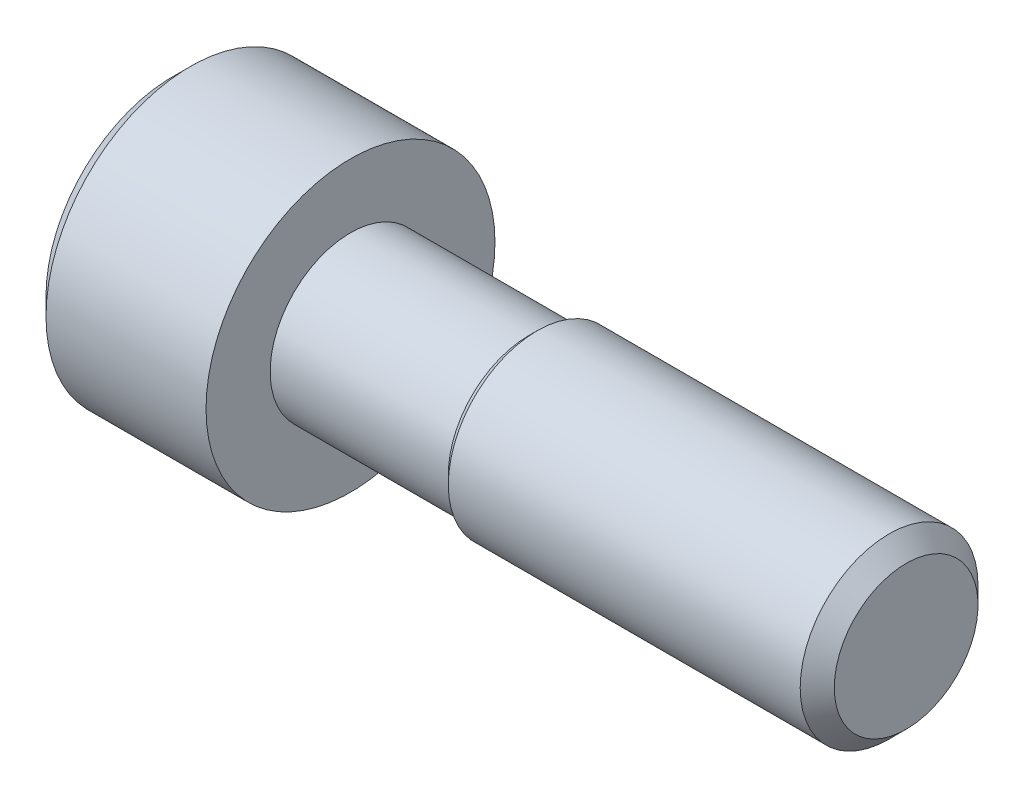
ISO-10303-21;
HEADER;
FILE_DESCRIPTION(('STEP AP214'),'2;1');
FILE_NAME('part.step','',(''),(''),'','','');
FILE_SCHEMA(('AUTOMOTIVE_DESIGN { 1 0 10303 214 1 1 1 1 }'));
ENDSEC;
DATA;
#1=APPLICATION_CONTEXT('core data for automotive mechanical design processes');
#2=APPLICATION_PROTOCOL_DEFINITION('international standard','automotive_design',2000,#1);
#3=PRODUCT_CONTEXT('',#1,'mechanical');
#4=PRODUCT('Part','Part','',(#3));
#5=PRODUCT_RELATED_PRODUCT_CATEGORY('part','',(#4));
#6=PRODUCT_DEFINITION_FORMATION('','',#4);
#7=PRODUCT_DEFINITION_CONTEXT('part definition',#1,'design');
#8=PRODUCT_DEFINITION('design','',#6,#7);
#9=PRODUCT_DEFINITION_SHAPE('','',#8);
#10=(LENGTH_UNIT() NAMED_UNIT(*) SI_UNIT(.MILLI.,.METRE.));
#11=(NAMED_UNIT(*) PLANE_ANGLE_UNIT() SI_UNIT($,.RADIAN.));
#12=(NAMED_UNIT(*) SI_UNIT($,.STERADIAN.) SOLID_ANGLE_UNIT());
#13=UNCERTAINTY_MEASURE_WITH_UNIT(LENGTH_MEASURE(1.E-05),#10,'distance_accuracy_value','');
#14=(GEOMETRIC_REPRESENTATION_CONTEXT(3) GLOBAL_UNCERTAINTY_ASSIGNED_CONTEXT((#13)) GLOBAL_UNIT_ASSIGNED_CONTEXT((#10,
#11,#12)) REPRESENTATION_CONTEXT('',''));
#15=CARTESIAN_POINT('',(0.,0.,0.));
#16=DIRECTION('',(0.,0.,1.));
#17=DIRECTION('',(1.,0.,0.));
#18=AXIS2_PLACEMENT_3D('',#15,#16,#17);
#19=CARTESIAN_POINT('',(-4.,0.,0.));
#20=DIRECTION('',(1.,0.,0.));
#21=DIRECTION('',(0.,0.,-1.));
#22=AXIS2_PLACEMENT_3D('',#19,#20,#21);
#23=PLANE('',#22);
#24=DIRECTION('',(0.,1.,0.));
#25=VECTOR('',#24,1.);
#26=CARTESIAN_POINT('',(-4.,0.,3.));
#27=LINE('',#26,#25);
#28=CARTESIAN_POINT('',(-4.,1.73205080756888,3.));
#29=VERTEX_POINT('',#28);
#30=CARTESIAN_POINT('',(-4.00000000000193,0.,3.00000000002137));
#31=VERTEX_POINT('',#30);
#32=EDGE_CURVE('E87',#29,#31,#27,.F.);
#33=ORIENTED_EDGE('',*,*,#32,.F.);
#34=DIRECTION('',(0.,-0.500000000000001,0.866025403784438));
#35=VECTOR('',#34,1.);
#36=CARTESIAN_POINT('',(-4.,2.59807621135332,1.5));
#37=LINE('',#36,#35);
#38=CARTESIAN_POINT('',(-4.00000000000193,2.59807621137183,1.50000000001069));
#39=VERTEX_POINT('',#38);
#40=EDGE_CURVE('E108',#39,#29,#37,.T.);
#41=ORIENTED_EDGE('',*,*,#40,.F.);
#42=CARTESIAN_POINT('',(-4.00000000000387,0.,0.));
#43=DIRECTION('',(-1.,0.,0.));
#44=DIRECTION('',(0.,0.,1.));
#45=AXIS2_PLACEMENT_3D('',#42,#43,#44);
#46=CIRCLE('',#45,3.00000000004275);
#47=EDGE_CURVE('E20',#39,#31,#46,.F.);
#48=ORIENTED_EDGE('',*,*,#47,.T.);
#49=EDGE_LOOP('',(#33,#41,#48));
#50=FACE_BOUND('',#49,.T.);
#51=ADVANCED_FACE('F17',(#50),#23,.F.);
#52=CARTESIAN_POINT('',(-4.,0.,0.));
#53=DIRECTION('',(1.,0.,0.));
#54=DIRECTION('',(0.,0.,-1.));
#55=AXIS2_PLACEMENT_3D('',#52,#53,#54);
#56=PLANE('',#55);
#57=DIRECTION('',(0.,-0.500000000000001,-0.866025403784438));
#58=VECTOR('',#57,1.);
#59=CARTESIAN_POINT('',(-4.,-1.73205080756888,3.));
#60=LINE('',#59,#58);
#61=CARTESIAN_POINT('',(-4.,-1.73205080756888,3.));
#62=VERTEX_POINT('',#61);
#63=CARTESIAN_POINT('',(-4.00000000000193,-2.59807621137183,1.50000000001069));
#64=VERTEX_POINT('',#63);
#65=EDGE_CURVE('E127',#62,#64,#60,.T.);
#66=ORIENTED_EDGE('',*,*,#65,.F.);
#67=DIRECTION('',(0.,1.,0.));
#68=VECTOR('',#67,1.);
#69=CARTESIAN_POINT('',(-4.,0.,3.));
#70=LINE('',#69,#68);
#71=EDGE_CURVE('E139',#31,#62,#70,.F.);
#72=ORIENTED_EDGE('',*,*,#71,.F.);
#73=CARTESIAN_POINT('',(-4.00000000000387,0.,0.));
#74=DIRECTION('',(-1.,0.,0.));
#75=DIRECTION('',(0.,0.,1.));
#76=AXIS2_PLACEMENT_3D('',#73,#74,#75);
#77=CIRCLE('',#76,3.00000000004275);
#78=EDGE_CURVE('E118',#31,#64,#77,.F.);
#79=ORIENTED_EDGE('',*,*,#78,.T.);
#80=EDGE_LOOP('',(#66,#72,#79));
#81=FACE_BOUND('',#80,.T.);
#82=ADVANCED_FACE('F252',(#81),#56,.F.);
#83=CARTESIAN_POINT('',(-4.,0.,0.));
#84=DIRECTION('',(1.,0.,0.));
#85=DIRECTION('',(0.,0.,-1.));
#86=AXIS2_PLACEMENT_3D('',#83,#84,#85);
#87=PLANE('',#86);
#88=DIRECTION('',(0.,0.500000000000001,0.866025403784438));
#89=VECTOR('',#88,1.);
#90=CARTESIAN_POINT('',(-4.,1.73205080756888,-3.));
#91=LINE('',#90,#89);
#92=CARTESIAN_POINT('',(-4.,1.73205080756888,-3.));
#93=VERTEX_POINT('',#92);
#94=CARTESIAN_POINT('',(-4.00000000000193,2.59807621137183,-1.50000000001069));
#95=VERTEX_POINT('',#94);
#96=EDGE_CURVE('E119',#93,#95,#91,.T.);
#97=ORIENTED_EDGE('',*,*,#96,.F.);
#98=DIRECTION('',(0.,1.,0.));
#99=VECTOR('',#98,1.);
#100=CARTESIAN_POINT('',(-4.,0.,-3.));
#101=LINE('',#100,#99);
#102=CARTESIAN_POINT('',(-4.00000000000193,0.,-3.00000000002137));
#103=VERTEX_POINT('',#102);
#104=EDGE_CURVE('E121',#103,#93,#101,.T.);
#105=ORIENTED_EDGE('',*,*,#104,.F.);
#106=CARTESIAN_POINT('',(-4.00000000000387,0.,0.));
#107=DIRECTION('',(-1.,0.,0.));
#108=DIRECTION('',(0.,0.,1.));
#109=AXIS2_PLACEMENT_3D('',#106,#107,#108);
#110=CIRCLE('',#109,3.00000000004275);
#111=EDGE_CURVE('E103',#103,#95,#110,.F.);
#112=ORIENTED_EDGE('',*,*,#111,.T.);
#113=EDGE_LOOP('',(#97,#105,#112));
#114=FACE_BOUND('',#113,.T.);
#115=ADVANCED_FACE('F254',(#114),#87,.F.);
#116=CARTESIAN_POINT('',(-3.99999999990541,0.,0.));
#117=DIRECTION('',(-1.,0.,0.));
#118=DIRECTION('',(0.,0.,1.));
#119=AXIS2_PLACEMENT_3D('',#116,#117,#118);
#120=CONICAL_SURFACE('',#119,2.99999999987222,1.04719755110239);
#121=CARTESIAN_POINT('',(-2.26794919242934,3.41060513164848E-10,0.));
#122=VERTEX_POINT('',#121);
#123=VERTEX_LOOP('',#122);
#124=FACE_BOUND('',#123,.T.);
#125=ORIENTED_EDGE('',*,*,#47,.F.);
#126=CARTESIAN_POINT('',(-4.00000000000387,0.,0.));
#127=DIRECTION('',(-1.,0.,0.));
#128=DIRECTION('',(0.,0.,1.));
#129=AXIS2_PLACEMENT_3D('',#126,#127,#128);
#130=CIRCLE('',#129,3.00000000004275);
#131=EDGE_CURVE('E93',#95,#39,#130,.F.);
#132=ORIENTED_EDGE('',*,*,#131,.F.);
#133=ORIENTED_EDGE('',*,*,#111,.F.);
#134=CARTESIAN_POINT('',(-4.00000000000387,0.,0.));
#135=DIRECTION('',(-1.,0.,0.));
#136=DIRECTION('',(0.,0.,1.));
#137=AXIS2_PLACEMENT_3D('',#134,#135,#136);
#138=CIRCLE('',#137,3.00000000004275);
#139=CARTESIAN_POINT('',(-4.00000000000193,-2.59807621137183,-1.50000000001069));
#140=VERTEX_POINT('',#139);
#141=EDGE_CURVE('E177',#103,#140,#138,.T.);
#142=ORIENTED_EDGE('',*,*,#141,.T.);
#143=CARTESIAN_POINT('',(-4.00000000000387,0.,0.));
#144=DIRECTION('',(-1.,0.,0.));
#145=DIRECTION('',(0.,0.,1.));
#146=AXIS2_PLACEMENT_3D('',#143,#144,#145);
#147=CIRCLE('',#146,3.00000000004275);
#148=EDGE_CURVE('E120',#64,#140,#147,.F.);
#149=ORIENTED_EDGE('',*,*,#148,.F.);
#150=ORIENTED_EDGE('',*,*,#78,.F.);
#151=EDGE_LOOP('',(#125,#132,#133,#142,#149,#150));
#152=FACE_BOUND('',#151,.T.);
#153=ADVANCED_FACE('F116',(#124,#152),#120,.F.);
#154=CARTESIAN_POINT('',(-4.,0.,0.));
#155=DIRECTION('',(1.,0.,0.));
#156=DIRECTION('',(0.,0.,-1.));
#157=AXIS2_PLACEMENT_3D('',#154,#155,#156);
#158=PLANE('',#157);
#159=DIRECTION('',(0.,1.,0.));
#160=VECTOR('',#159,1.);
#161=CARTESIAN_POINT('',(-4.,0.,-3.));
#162=LINE('',#161,#160);
#163=CARTESIAN_POINT('',(-4.,-1.73205080756888,-3.));
#164=VERTEX_POINT('',#163);
#165=EDGE_CURVE('E102',#164,#103,#162,.T.);
#166=ORIENTED_EDGE('',*,*,#165,.F.);
#167=DIRECTION('',(0.,0.5,-0.866025403784439));
#168=VECTOR('',#167,1.);
#169=CARTESIAN_POINT('',(-4.,-1.73205080756888,-3.));
#170=LINE('',#169,#168);
#171=EDGE_CURVE('E192',#164,#140,#170,.F.);
#172=ORIENTED_EDGE('',*,*,#171,.T.);
#173=ORIENTED_EDGE('',*,*,#141,.F.);
#174=EDGE_LOOP('',(#166,#172,#173));
#175=FACE_BOUND('',#174,.T.);
#176=ADVANCED_FACE('F193',(#175),#158,.F.);
#177=CARTESIAN_POINT('',(-4.,0.,0.));
#178=DIRECTION('',(1.,0.,0.));
#179=DIRECTION('',(0.,0.,-1.));
#180=AXIS2_PLACEMENT_3D('',#177,#178,#179);
#181=PLANE('',#180);
#182=DIRECTION('',(0.,0.5,-0.866025403784439));
#183=VECTOR('',#182,1.);
#184=CARTESIAN_POINT('',(-4.,-1.73205080756888,-3.));
#185=LINE('',#184,#183);
#186=CARTESIAN_POINT('',(-4.,-3.46410161513775,0.));
#187=VERTEX_POINT('',#186);
#188=EDGE_CURVE('E186',#140,#187,#185,.F.);
#189=ORIENTED_EDGE('',*,*,#188,.T.);
#190=DIRECTION('',(0.,-0.5,-0.866025403784439));
#191=VECTOR('',#190,1.);
#192=CARTESIAN_POINT('',(-4.,-3.46410161513775,0.));
#193=LINE('',#192,#191);
#194=EDGE_CURVE('E179',#187,#64,#193,.F.);
#195=ORIENTED_EDGE('',*,*,#194,.T.);
#196=ORIENTED_EDGE('',*,*,#148,.T.);
#197=EDGE_LOOP('',(#189,#195,#196));
#198=FACE_BOUND('',#197,.T.);
#199=ADVANCED_FACE('F184',(#198),#181,.F.);
#200=CARTESIAN_POINT('',(-4.,0.,0.));
#201=DIRECTION('',(1.,0.,0.));
#202=DIRECTION('',(0.,0.,-1.));
#203=AXIS2_PLACEMENT_3D('',#200,#201,#202);
#204=PLANE('',#203);
#205=DIRECTION('',(0.,-0.5,0.866025403784439));
#206=VECTOR('',#205,1.);
#207=CARTESIAN_POINT('',(-4.,1.73205080756888,3.));
#208=LINE('',#207,#206);
#209=CARTESIAN_POINT('',(-4.,3.46410161513775,0.));
#210=VERTEX_POINT('',#209);
#211=EDGE_CURVE('E96',#39,#210,#208,.F.);
#212=ORIENTED_EDGE('',*,*,#211,.T.);
#213=DIRECTION('',(0.,0.5,0.866025403784439));
#214=VECTOR('',#213,1.);
#215=CARTESIAN_POINT('',(-4.,3.46410161513775,0.));
#216=LINE('',#215,#214);
#217=EDGE_CURVE('E98',#210,#95,#216,.F.);
#218=ORIENTED_EDGE('',*,*,#217,.T.);
#219=ORIENTED_EDGE('',*,*,#131,.T.);
#220=EDGE_LOOP('',(#212,#218,#219));
#221=FACE_BOUND('',#220,.T.);
#222=ADVANCED_FACE('F95',(#221),#204,.F.);
#223=CARTESIAN_POINT('',(-8.,-3.46410161513775,0.));
#224=DIRECTION('',(0.,-0.866025403784439,0.5));
#225=DIRECTION('',(0.,-0.5,-0.866025403784439));
#226=AXIS2_PLACEMENT_3D('',#223,#224,#225);
#227=PLANE('',#226);
#228=DIRECTION('',(1.,0.,0.));
#229=VECTOR('',#228,1.);
#230=CARTESIAN_POINT('',(-8.,-1.73205080756888,3.));
#231=LINE('',#230,#229);
#232=CARTESIAN_POINT('',(-8.,-1.73205080756888,3.));
#233=VERTEX_POINT('',#232);
#234=EDGE_CURVE('E153',#233,#62,#231,.T.);
#235=ORIENTED_EDGE('',*,*,#234,.T.);
#236=ORIENTED_EDGE('',*,*,#65,.T.);
#237=ORIENTED_EDGE('',*,*,#194,.F.);
#238=DIRECTION('',(1.,0.,0.));
#239=VECTOR('',#238,1.);
#240=CARTESIAN_POINT('',(-8.,-3.46410161513776,0.));
#241=LINE('',#240,#239);
#242=CARTESIAN_POINT('',(-8.,-3.46410161513775,0.));
#243=VERTEX_POINT('',#242);
#244=EDGE_CURVE('E201',#187,#243,#241,.F.);
#245=ORIENTED_EDGE('',*,*,#244,.T.);
#246=DIRECTION('',(0.,-0.499999999999998,-0.86602540378444));
#247=VECTOR('',#246,1.);
#248=CARTESIAN_POINT('',(-8.,-1.73205080756888,3.));
#249=LINE('',#248,#247);
#250=EDGE_CURVE('E159',#233,#243,#249,.T.);
#251=ORIENTED_EDGE('',*,*,#250,.F.);
#252=EDGE_LOOP('',(#235,#236,#237,#245,#251));
#253=FACE_BOUND('',#252,.T.);
#254=ADVANCED_FACE('F248',(#253),#227,.F.);
#255=CARTESIAN_POINT('',(-8.,-1.73205080756888,-3.));
#256=DIRECTION('',(0.,-0.866025403784439,-0.5));
#257=DIRECTION('',(0.,0.5,-0.866025403784439));
#258=AXIS2_PLACEMENT_3D('',#255,#256,#257);
#259=PLANE('',#258);
#260=ORIENTED_EDGE('',*,*,#244,.F.);
#261=ORIENTED_EDGE('',*,*,#188,.F.);
#262=ORIENTED_EDGE('',*,*,#171,.F.);
#263=DIRECTION('',(-1.,0.,0.));
#264=VECTOR('',#263,1.);
#265=CARTESIAN_POINT('',(-8.,-1.73205080756888,-3.));
#266=LINE('',#265,#264);
#267=CARTESIAN_POINT('',(-8.,-1.73205080756888,-3.));
#268=VERTEX_POINT('',#267);
#269=EDGE_CURVE('E203',#164,#268,#266,.T.);
#270=ORIENTED_EDGE('',*,*,#269,.T.);
#271=DIRECTION('',(0.,0.499999999999998,-0.86602540378444));
#272=VECTOR('',#271,1.);
#273=CARTESIAN_POINT('',(-8.,-3.46410161513775,0.));
#274=LINE('',#273,#272);
#275=EDGE_CURVE('E240',#243,#268,#274,.T.);
#276=ORIENTED_EDGE('',*,*,#275,.F.);
#277=EDGE_LOOP('',(#260,#261,#262,#270,#276));
#278=FACE_BOUND('',#277,.T.);
#279=ADVANCED_FACE('F199',(#278),#259,.F.);
#280=CARTESIAN_POINT('',(-8.,1.73205080756888,-3.));
#281=DIRECTION('',(0.,0.,-1.));
#282=DIRECTION('',(-1.,0.,0.));
#283=AXIS2_PLACEMENT_3D('',#280,#281,#282);
#284=PLANE('',#283);
#285=ORIENTED_EDGE('',*,*,#269,.F.);
#286=ORIENTED_EDGE('',*,*,#165,.T.);
#287=ORIENTED_EDGE('',*,*,#104,.T.);
#288=DIRECTION('',(1.,0.,0.));
#289=VECTOR('',#288,1.);
#290=CARTESIAN_POINT('',(-8.,1.73205080756887,-3.));
#291=LINE('',#290,#289);
#292=CARTESIAN_POINT('',(-8.,1.73205080756888,-3.));
#293=VERTEX_POINT('',#292);
#294=EDGE_CURVE('E110',#93,#293,#291,.F.);
#295=ORIENTED_EDGE('',*,*,#294,.T.);
#296=DIRECTION('',(0.,1.,0.));
#297=VECTOR('',#296,1.);
#298=CARTESIAN_POINT('',(-8.,4.35,-3.));
#299=LINE('',#298,#297);
#300=EDGE_CURVE('E238',#268,#293,#299,.T.);
#301=ORIENTED_EDGE('',*,*,#300,.F.);
#302=EDGE_LOOP('',(#285,#286,#287,#295,#301));
#303=FACE_BOUND('',#302,.T.);
#304=ADVANCED_FACE('F308',(#303),#284,.F.);
#305=CARTESIAN_POINT('',(-8.,3.46410161513775,0.));
#306=DIRECTION('',(0.,0.866025403784439,-0.5));
#307=DIRECTION('',(0.,0.5,0.866025403784439));
#308=AXIS2_PLACEMENT_3D('',#305,#306,#307);
#309=PLANE('',#308);
#310=ORIENTED_EDGE('',*,*,#294,.F.);
#311=ORIENTED_EDGE('',*,*,#96,.T.);
#312=ORIENTED_EDGE('',*,*,#217,.F.);
#313=DIRECTION('',(1.,0.,0.));
#314=VECTOR('',#313,1.);
#315=CARTESIAN_POINT('',(-8.,3.46410161513776,0.));
#316=LINE('',#315,#314);
#317=CARTESIAN_POINT('',(-8.,3.46410161513775,0.));
#318=VERTEX_POINT('',#317);
#319=EDGE_CURVE('E109',#210,#318,#316,.F.);
#320=ORIENTED_EDGE('',*,*,#319,.T.);
#321=DIRECTION('',(0.,0.499999999999998,0.86602540378444));
#322=VECTOR('',#321,1.);
#323=CARTESIAN_POINT('',(-8.,1.73205080756888,-3.));
#324=LINE('',#323,#322);
#325=EDGE_CURVE('E229',#293,#318,#324,.T.);
#326=ORIENTED_EDGE('',*,*,#325,.F.);
#327=EDGE_LOOP('',(#310,#311,#312,#320,#326));
#328=FACE_BOUND('',#327,.T.);
#329=ADVANCED_FACE('F227',(#328),#309,.F.);
#330=CARTESIAN_POINT('',(-8.,1.73205080756888,3.));
#331=DIRECTION('',(0.,0.866025403784439,0.5));
#332=DIRECTION('',(0.,-0.5,0.866025403784439));
#333=AXIS2_PLACEMENT_3D('',#330,#331,#332);
#334=PLANE('',#333);
#335=ORIENTED_EDGE('',*,*,#319,.F.);
#336=ORIENTED_EDGE('',*,*,#211,.F.);
#337=ORIENTED_EDGE('',*,*,#40,.T.);
#338=DIRECTION('',(1.,0.,0.));
#339=VECTOR('',#338,1.);
#340=CARTESIAN_POINT('',(-8.,1.73205080756888,3.));
#341=LINE('',#340,#339);
#342=CARTESIAN_POINT('',(-8.,1.73205080756888,3.));
#343=VERTEX_POINT('',#342);
#344=EDGE_CURVE('E35',#29,#343,#341,.F.);
#345=ORIENTED_EDGE('',*,*,#344,.T.);
#346=DIRECTION('',(0.,-0.499999999999998,0.86602540378444));
#347=VECTOR('',#346,1.);
#348=CARTESIAN_POINT('',(-8.,3.46410161513775,0.));
#349=LINE('',#348,#347);
#350=EDGE_CURVE('E232',#318,#343,#349,.T.);
#351=ORIENTED_EDGE('',*,*,#350,.F.);
#352=EDGE_LOOP('',(#335,#336,#337,#345,#351));
#353=FACE_BOUND('',#352,.T.);
#354=ADVANCED_FACE('F107',(#353),#334,.F.);
#355=CARTESIAN_POINT('',(-8.,-1.73205080756888,3.));
#356=DIRECTION('',(0.,0.,1.));
#357=DIRECTION('',(1.,0.,0.));
#358=AXIS2_PLACEMENT_3D('',#355,#356,#357);
#359=PLANE('',#358);
#360=ORIENTED_EDGE('',*,*,#344,.F.);
#361=ORIENTED_EDGE('',*,*,#32,.T.);
#362=ORIENTED_EDGE('',*,*,#71,.T.);
#363=ORIENTED_EDGE('',*,*,#234,.F.);
#364=DIRECTION('',(0.,1.,0.));
#365=VECTOR('',#364,1.);
#366=CARTESIAN_POINT('',(-8.,4.35,3.));
#367=LINE('',#366,#365);
#368=EDGE_CURVE('E176',#343,#233,#367,.F.);
#369=ORIENTED_EDGE('',*,*,#368,.F.);
#370=EDGE_LOOP('',(#360,#361,#362,#363,#369));
#371=FACE_BOUND('',#370,.T.);
#372=ADVANCED_FACE('F250',(#371),#359,.F.);
#373=CARTESIAN_POINT('',(-8.,4.35,0.));
#374=DIRECTION('',(-1.,0.,0.));
#375=DIRECTION('',(0.,0.,1.));
#376=AXIS2_PLACEMENT_3D('',#373,#374,#375);
#377=PLANE('',#376);
#378=CARTESIAN_POINT('',(-8.00000000009504,0.,0.));
#379=DIRECTION('',(1.,0.,0.));
#380=DIRECTION('',(0.,0.,-1.));
#381=AXIS2_PLACEMENT_3D('',#378,#379,#380);
#382=CIRCLE('',#381,5.69999999999027);
#383=CARTESIAN_POINT('',(-8.00000000009504,0.,-5.69999999999027));
#384=VERTEX_POINT('',#383);
#385=EDGE_CURVE('E173',#384,#384,#382,.T.);
#386=ORIENTED_EDGE('',*,*,#385,.F.);
#387=EDGE_LOOP('',(#386));
#388=FACE_BOUND('',#387,.T.);
#389=ORIENTED_EDGE('',*,*,#350,.T.);
#390=ORIENTED_EDGE('',*,*,#368,.T.);
#391=ORIENTED_EDGE('',*,*,#250,.T.);
#392=ORIENTED_EDGE('',*,*,#275,.T.);
#393=ORIENTED_EDGE('',*,*,#300,.T.);
#394=ORIENTED_EDGE('',*,*,#325,.T.);
#395=EDGE_LOOP('',(#389,#390,#391,#392,#393,#394));
#396=FACE_BOUND('',#395,.T.);
#397=ADVANCED_FACE('F236',(#388,#396),#377,.T.);
#398=CARTESIAN_POINT('',(-7.20000000001164,0.,0.));
#399=DIRECTION('',(1.,0.,0.));
#400=DIRECTION('',(0.,0.,-1.));
#401=AXIS2_PLACEMENT_3D('',#398,#399,#400);
#402=CONICAL_SURFACE('',#401,6.50000000007367,0.785398163397448);
#403=ORIENTED_EDGE('',*,*,#385,.T.);
#404=EDGE_LOOP('',(#403));
#405=FACE_BOUND('',#404,.T.);
#406=CARTESIAN_POINT('',(-7.2,0.,0.));
#407=DIRECTION('',(1.,0.,0.));
#408=DIRECTION('',(0.,0.,-1.));
#409=AXIS2_PLACEMENT_3D('',#406,#407,#408);
#410=CIRCLE('',#409,6.5);
#411=CARTESIAN_POINT('',(-7.2,0.,-6.5));
#412=VERTEX_POINT('',#411);
#413=EDGE_CURVE('E172',#412,#412,#410,.T.);
#414=ORIENTED_EDGE('',*,*,#413,.F.);
#415=EDGE_LOOP('',(#414));
#416=FACE_BOUND('',#415,.T.);
#417=ADVANCED_FACE('F294',(#405,#416),#402,.T.);
#418=CARTESIAN_POINT('',(-3.6,0.,0.));
#419=DIRECTION('',(1.,0.,0.));
#420=DIRECTION('',(0.,0.,-1.));
#421=AXIS2_PLACEMENT_3D('',#418,#419,#420);
#422=CYLINDRICAL_SURFACE('',#421,6.5);
#423=ORIENTED_EDGE('',*,*,#413,.T.);
#424=EDGE_LOOP('',(#423));
#425=FACE_BOUND('',#424,.T.);
#426=CARTESIAN_POINT('',(0.,0.,0.));
#427=DIRECTION('',(1.,0.,0.));
#428=DIRECTION('',(0.,0.,-1.));
#429=AXIS2_PLACEMENT_3D('',#426,#427,#428);
#430=CIRCLE('',#429,6.5);
#431=CARTESIAN_POINT('',(0.,0.,-6.5));
#432=VERTEX_POINT('',#431);
#433=EDGE_CURVE('E169',#432,#432,#430,.T.);
#434=ORIENTED_EDGE('',*,*,#433,.F.);
#435=EDGE_LOOP('',(#434));
#436=FACE_BOUND('',#435,.T.);
#437=ADVANCED_FACE('F290',(#425,#436),#422,.T.);
#438=CARTESIAN_POINT('',(0.,5.058020375,0.));
#439=DIRECTION('',(1.,0.,0.));
#440=DIRECTION('',(0.,0.,-1.));
#441=AXIS2_PLACEMENT_3D('',#438,#439,#440);
#442=PLANE('',#441);
#443=CARTESIAN_POINT('',(0.,0.,0.));
#444=DIRECTION('',(1.,0.,0.));
#445=DIRECTION('',(0.,0.,-1.));
#446=AXIS2_PLACEMENT_3D('',#443,#444,#445);
#447=CIRCLE('',#446,3.61604075);
#448=CARTESIAN_POINT('',(0.,0.,-3.61604075));
#449=VERTEX_POINT('',#448);
#450=EDGE_CURVE('E166',#449,#449,#447,.T.);
#451=ORIENTED_EDGE('',*,*,#450,.F.);
#452=EDGE_LOOP('',(#451));
#453=FACE_BOUND('',#452,.T.);
#454=ORIENTED_EDGE('',*,*,#433,.T.);
#455=EDGE_LOOP('',(#454));
#456=FACE_BOUND('',#455,.T.);
#457=ADVANCED_FACE('F286',(#453,#456),#442,.T.);
#458=CARTESIAN_POINT('',(25.,1.6165,0.));
#459=DIRECTION('',(1.,0.,0.));
#460=DIRECTION('',(0.,0.,-1.));
#461=AXIS2_PLACEMENT_3D('',#458,#459,#460);
#462=PLANE('',#461);
#463=CARTESIAN_POINT('',(25.0000000000341,0.,0.));
#464=DIRECTION('',(-1.,0.,0.));
#465=DIRECTION('',(0.,0.,1.));
#466=AXIS2_PLACEMENT_3D('',#463,#464,#465);
#467=CIRCLE('',#466,3.23299999996607);
#468=CARTESIAN_POINT('',(25.0000000000341,0.,3.23299999996607));
#469=VERTEX_POINT('',#468);
#470=EDGE_CURVE('E162',#469,#469,#467,.T.);
#471=ORIENTED_EDGE('',*,*,#470,.F.);
#472=EDGE_LOOP('',(#471));
#473=FACE_BOUND('',#472,.T.);
#474=ADVANCED_FACE('F282',(#473),#462,.T.);
#475=CARTESIAN_POINT('',(4.008020375,0.,0.));
#476=DIRECTION('',(1.,0.,0.));
#477=DIRECTION('',(0.,0.,-1.));
#478=AXIS2_PLACEMENT_3D('',#475,#476,#477);
#479=CYLINDRICAL_SURFACE('',#478,3.61604075);
#480=CARTESIAN_POINT('',(8.01604074996476,0.,0.));
#481=DIRECTION('',(1.,0.,0.));
#482=DIRECTION('',(0.,1.,0.));
#483=AXIS2_PLACEMENT_3D('',#480,#481,#482);
#484=CIRCLE('',#483,3.61604074998922);
#485=CARTESIAN_POINT('',(8.01604074996476,3.61604074998922,0.));
#486=VERTEX_POINT('',#485);
#487=EDGE_CURVE('E165',#486,#486,#484,.T.);
#488=ORIENTED_EDGE('',*,*,#487,.F.);
#489=EDGE_LOOP('',(#488));
#490=FACE_BOUND('',#489,.T.);
#491=ORIENTED_EDGE('',*,*,#450,.T.);
#492=EDGE_LOOP('',(#491));
#493=FACE_BOUND('',#492,.T.);
#494=ADVANCED_FACE('F278',(#490,#493),#479,.T.);
#495=CARTESIAN_POINT('',(24.2330000000379,0.,0.));
#496=DIRECTION('',(-1.,0.,0.));
#497=DIRECTION('',(0.,0.,1.));
#498=AXIS2_PLACEMENT_3D('',#495,#496,#497);
#499=CONICAL_SURFACE('',#498,4.0000000000191,0.785398163434504);
#500=ORIENTED_EDGE('',*,*,#470,.T.);
#501=EDGE_LOOP('',(#500));
#502=FACE_BOUND('',#501,.T.);
#503=CARTESIAN_POINT('',(24.233,0.,0.));
#504=DIRECTION('',(1.,0.,0.));
#505=DIRECTION('',(0.,0.,-1.));
#506=AXIS2_PLACEMENT_3D('',#503,#504,#505);
#507=CIRCLE('',#506,4.);
#508=CARTESIAN_POINT('',(24.233,0.,-4.));
#509=VERTEX_POINT('',#508);
#510=EDGE_CURVE('E26',#509,#509,#507,.F.);
#511=ORIENTED_EDGE('',*,*,#510,.F.);
#512=EDGE_LOOP('',(#511));
#513=FACE_BOUND('',#512,.T.);
#514=ADVANCED_FACE('F270',(#502,#513),#499,.T.);
#515=CARTESIAN_POINT('',(8.39999999999463,0.,0.));
#516=DIRECTION('',(1.,0.,0.));
#517=DIRECTION('',(0.,0.,-1.));
#518=AXIS2_PLACEMENT_3D('',#515,#516,#517);
#519=CONICAL_SURFACE('',#518,4.0000000000191,0.785398163397448);
#520=ORIENTED_EDGE('',*,*,#487,.T.);
#521=EDGE_LOOP('',(#520));
#522=FACE_BOUND('',#521,.T.);
#523=CARTESIAN_POINT('',(8.4,0.,0.));
#524=DIRECTION('',(1.,0.,0.));
#525=DIRECTION('',(0.,0.,-1.));
#526=AXIS2_PLACEMENT_3D('',#523,#524,#525);
#527=CIRCLE('',#526,4.);
#528=CARTESIAN_POINT('',(8.4,0.,-4.));
#529=VERTEX_POINT('',#528);
#530=EDGE_CURVE('E11',#529,#529,#527,.T.);
#531=ORIENTED_EDGE('',*,*,#530,.F.);
#532=EDGE_LOOP('',(#531));
#533=FACE_BOUND('',#532,.T.);
#534=ADVANCED_FACE('F264',(#522,#533),#519,.T.);
#535=CARTESIAN_POINT('',(16.3165,0.,0.));
#536=DIRECTION('',(1.,0.,0.));
#537=DIRECTION('',(0.,0.,-1.));
#538=AXIS2_PLACEMENT_3D('',#535,#536,#537);
#539=CYLINDRICAL_SURFACE('',#538,4.);
#540=ORIENTED_EDGE('',*,*,#510,.T.);
#541=EDGE_LOOP('',(#540));
#542=FACE_BOUND('',#541,.T.);
#543=ORIENTED_EDGE('',*,*,#530,.T.);
#544=EDGE_LOOP('',(#543));
#545=FACE_BOUND('',#544,.T.);
#546=ADVANCED_FACE('F262',(#542,#545),#539,.T.);
#547=CLOSED_SHELL('',(#51,#82,#115,#153,#176,#199,#222,#254,#279,#304,#329,#354,#372,#397,#417,
#437,#457,#474,#494,#514,#534,#546));
#548=MANIFOLD_SOLID_BREP('B1',#547);
#549=ADVANCED_BREP_SHAPE_REPRESENTATION('',(#18,#548),#14);
#550=SHAPE_DEFINITION_REPRESENTATION(#9,#549);
ENDSEC;
END-ISO-10303-21;
